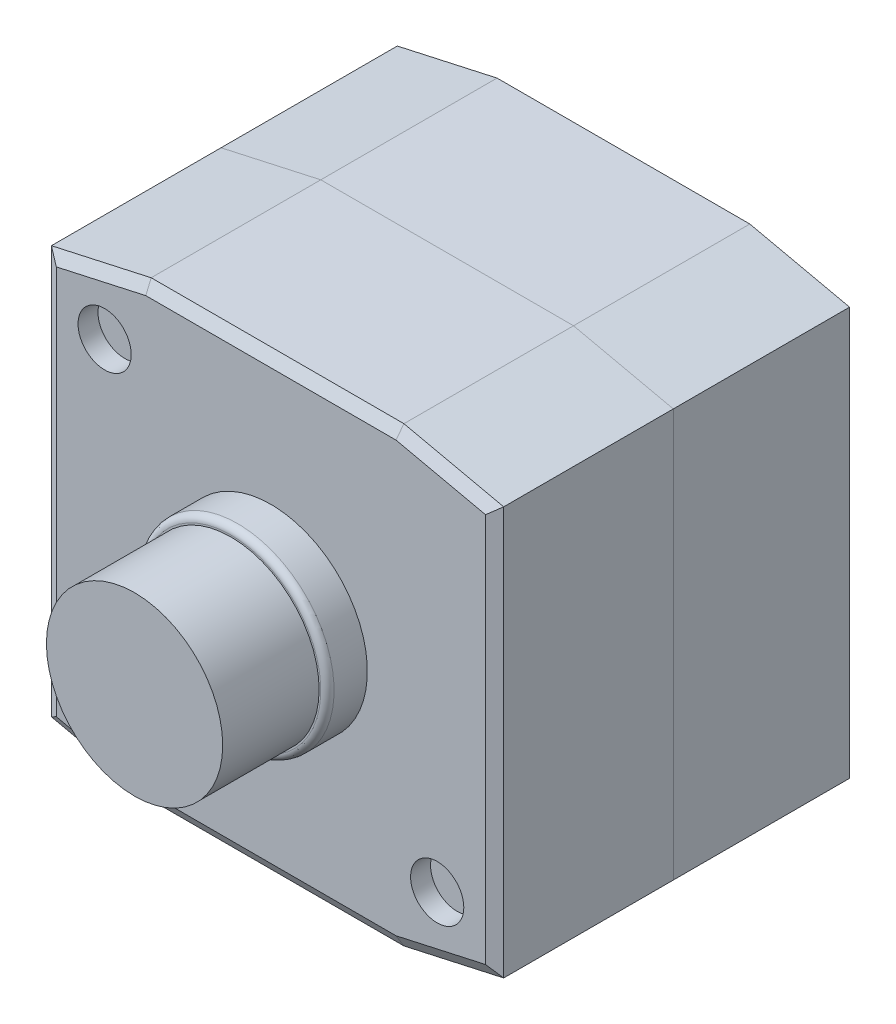
ISO-10303-21;
HEADER;
FILE_DESCRIPTION(('STEP AP214'),'2;1');
FILE_NAME('part.step','',(''),(''),'','','');
FILE_SCHEMA(('AUTOMOTIVE_DESIGN { 1 0 10303 214 1 1 1 1 }'));
ENDSEC;
DATA;
#1=APPLICATION_CONTEXT('core data for automotive mechanical design processes');
#2=APPLICATION_PROTOCOL_DEFINITION('international standard','automotive_design',2000,#1);
#3=PRODUCT_CONTEXT('',#1,'mechanical');
#4=PRODUCT('Part','Part','',(#3));
#5=PRODUCT_RELATED_PRODUCT_CATEGORY('part','',(#4));
#6=PRODUCT_DEFINITION_FORMATION('','',#4);
#7=PRODUCT_DEFINITION_CONTEXT('part definition',#1,'design');
#8=PRODUCT_DEFINITION('design','',#6,#7);
#9=PRODUCT_DEFINITION_SHAPE('','',#8);
#10=(LENGTH_UNIT() NAMED_UNIT(*) SI_UNIT(.MILLI.,.METRE.));
#11=(NAMED_UNIT(*) PLANE_ANGLE_UNIT() SI_UNIT($,.RADIAN.));
#12=(NAMED_UNIT(*) SI_UNIT($,.STERADIAN.) SOLID_ANGLE_UNIT());
#13=UNCERTAINTY_MEASURE_WITH_UNIT(LENGTH_MEASURE(1.E-05),#10,'distance_accuracy_value','');
#14=(GEOMETRIC_REPRESENTATION_CONTEXT(3) GLOBAL_UNCERTAINTY_ASSIGNED_CONTEXT((#13)) GLOBAL_UNIT_ASSIGNED_CONTEXT((#10,
#11,#12)) REPRESENTATION_CONTEXT('',''));
#15=CARTESIAN_POINT('',(0.,0.,0.));
#16=DIRECTION('',(0.,0.,1.));
#17=DIRECTION('',(1.,0.,0.));
#18=AXIS2_PLACEMENT_3D('',#15,#16,#17);
#19=CARTESIAN_POINT('',(-19.,0.,0.));
#20=DIRECTION('',(0.216439613938101,0.976296007119934,0.));
#21=DIRECTION('',(-0.976296007119934,0.216439613938101,0.));
#22=AXIS2_PLACEMENT_3D('',#19,#20,#21);
#23=PLANE('',#22);
#24=DIRECTION('',(-0.976296007119934,0.216439613938101,0.));
#25=VECTOR('',#24,1.);
#26=CARTESIAN_POINT('',(-19.,0.,26.5));
#27=LINE('',#26,#25);
#28=CARTESIAN_POINT('',(-19.,0.,26.5));
#29=VERTEX_POINT('',#28);
#30=CARTESIAN_POINT('',(-34.,3.32541993964407,26.5));
#31=VERTEX_POINT('',#30);
#32=EDGE_CURVE('E153',#29,#31,#27,.T.);
#33=ORIENTED_EDGE('',*,*,#32,.T.);
#34=DIRECTION('',(0.,0.,1.));
#35=VECTOR('',#34,1.);
#36=CARTESIAN_POINT('',(-34.,3.32541993964407,0.));
#37=LINE('',#36,#35);
#38=CARTESIAN_POINT('',(-34.,3.32541993964407,0.));
#39=VERTEX_POINT('',#38);
#40=EDGE_CURVE('E12',#39,#31,#37,.T.);
#41=ORIENTED_EDGE('',*,*,#40,.F.);
#42=DIRECTION('',(-0.976296007119934,0.216439613938101,0.));
#43=VECTOR('',#42,1.);
#44=CARTESIAN_POINT('',(-19.,0.,0.));
#45=LINE('',#44,#43);
#46=CARTESIAN_POINT('',(-19.,0.,0.));
#47=VERTEX_POINT('',#46);
#48=EDGE_CURVE('E167',#47,#39,#45,.T.);
#49=ORIENTED_EDGE('',*,*,#48,.F.);
#50=DIRECTION('',(0.,0.,1.));
#51=VECTOR('',#50,1.);
#52=CARTESIAN_POINT('',(-19.,0.,0.));
#53=LINE('',#52,#51);
#54=EDGE_CURVE('E149',#47,#29,#53,.T.);
#55=ORIENTED_EDGE('',*,*,#54,.T.);
#56=EDGE_LOOP('',(#33,#41,#49,#55));
#57=FACE_BOUND('',#56,.T.);
#58=ADVANCED_FACE('F57',(#57),#23,.F.);
#59=CARTESIAN_POINT('',(-34.,3.32541993964407,0.));
#60=DIRECTION('',(1.,0.,0.));
#61=DIRECTION('',(0.,1.,0.));
#62=AXIS2_PLACEMENT_3D('',#59,#60,#61);
#63=PLANE('',#62);
#64=DIRECTION('',(0.,1.,0.));
#65=VECTOR('',#64,1.);
#66=CARTESIAN_POINT('',(-34.,3.32541993964407,26.5));
#67=LINE('',#66,#65);
#68=CARTESIAN_POINT('',(-34.,64.674580060356,26.5));
#69=VERTEX_POINT('',#68);
#70=EDGE_CURVE('E156',#31,#69,#67,.T.);
#71=ORIENTED_EDGE('',*,*,#70,.T.);
#72=DIRECTION('',(0.,0.,1.));
#73=VECTOR('',#72,1.);
#74=CARTESIAN_POINT('',(-34.,64.674580060356,0.));
#75=LINE('',#74,#73);
#76=CARTESIAN_POINT('',(-34.,64.674580060356,0.));
#77=VERTEX_POINT('',#76);
#78=EDGE_CURVE('E65',#77,#69,#75,.T.);
#79=ORIENTED_EDGE('',*,*,#78,.F.);
#80=DIRECTION('',(0.,1.,0.));
#81=VECTOR('',#80,1.);
#82=CARTESIAN_POINT('',(-34.,3.32541993964407,0.));
#83=LINE('',#82,#81);
#84=EDGE_CURVE('E116',#39,#77,#83,.T.);
#85=ORIENTED_EDGE('',*,*,#84,.F.);
#86=ORIENTED_EDGE('',*,*,#40,.T.);
#87=EDGE_LOOP('',(#71,#79,#85,#86));
#88=FACE_BOUND('',#87,.T.);
#89=ADVANCED_FACE('F202',(#88),#63,.F.);
#90=CARTESIAN_POINT('',(-34.,64.674580060356,0.));
#91=DIRECTION('',(0.2164396139381,-0.976296007119934,0.));
#92=DIRECTION('',(0.976296007119934,0.2164396139381,0.));
#93=AXIS2_PLACEMENT_3D('',#90,#91,#92);
#94=PLANE('',#93);
#95=DIRECTION('',(0.976296007119934,0.2164396139381,0.));
#96=VECTOR('',#95,1.);
#97=CARTESIAN_POINT('',(-34.,64.674580060356,26.5));
#98=LINE('',#97,#96);
#99=CARTESIAN_POINT('',(-19.,68.,26.5));
#100=VERTEX_POINT('',#99);
#101=EDGE_CURVE('E158',#69,#100,#98,.T.);
#102=ORIENTED_EDGE('',*,*,#101,.T.);
#103=DIRECTION('',(0.,0.,1.));
#104=VECTOR('',#103,1.);
#105=CARTESIAN_POINT('',(-19.,68.,0.));
#106=LINE('',#105,#104);
#107=CARTESIAN_POINT('',(-19.,68.,0.));
#108=VERTEX_POINT('',#107);
#109=EDGE_CURVE('E174',#108,#100,#106,.T.);
#110=ORIENTED_EDGE('',*,*,#109,.F.);
#111=DIRECTION('',(0.976296007119934,0.2164396139381,0.));
#112=VECTOR('',#111,1.);
#113=CARTESIAN_POINT('',(-34.,64.674580060356,0.));
#114=LINE('',#113,#112);
#115=EDGE_CURVE('E182',#77,#108,#114,.T.);
#116=ORIENTED_EDGE('',*,*,#115,.F.);
#117=ORIENTED_EDGE('',*,*,#78,.T.);
#118=EDGE_LOOP('',(#102,#110,#116,#117));
#119=FACE_BOUND('',#118,.T.);
#120=ADVANCED_FACE('F180',(#119),#94,.F.);
#121=CARTESIAN_POINT('',(-19.,68.,0.));
#122=DIRECTION('',(0.,-1.,0.));
#123=DIRECTION('',(0.,0.,-1.));
#124=AXIS2_PLACEMENT_3D('',#121,#122,#123);
#125=PLANE('',#124);
#126=DIRECTION('',(1.,0.,0.));
#127=VECTOR('',#126,1.);
#128=CARTESIAN_POINT('',(-19.,68.,26.5));
#129=LINE('',#128,#127);
#130=CARTESIAN_POINT('',(19.,68.,26.5));
#131=VERTEX_POINT('',#130);
#132=EDGE_CURVE('E160',#100,#131,#129,.T.);
#133=ORIENTED_EDGE('',*,*,#132,.T.);
#134=DIRECTION('',(0.,0.,1.));
#135=VECTOR('',#134,1.);
#136=CARTESIAN_POINT('',(19.,68.,0.));
#137=LINE('',#136,#135);
#138=CARTESIAN_POINT('',(19.,68.,0.));
#139=VERTEX_POINT('',#138);
#140=EDGE_CURVE('E171',#139,#131,#137,.T.);
#141=ORIENTED_EDGE('',*,*,#140,.F.);
#142=DIRECTION('',(1.,0.,0.));
#143=VECTOR('',#142,1.);
#144=CARTESIAN_POINT('',(-19.,68.,0.));
#145=LINE('',#144,#143);
#146=EDGE_CURVE('E194',#108,#139,#145,.T.);
#147=ORIENTED_EDGE('',*,*,#146,.F.);
#148=ORIENTED_EDGE('',*,*,#109,.T.);
#149=EDGE_LOOP('',(#133,#141,#147,#148));
#150=FACE_BOUND('',#149,.T.);
#151=ADVANCED_FACE('F190',(#150),#125,.F.);
#152=CARTESIAN_POINT('',(19.,68.,0.));
#153=DIRECTION('',(-0.216439613938102,-0.976296007119934,0.));
#154=DIRECTION('',(0.976296007119934,-0.216439613938102,0.));
#155=AXIS2_PLACEMENT_3D('',#152,#153,#154);
#156=PLANE('',#155);
#157=DIRECTION('',(0.976296007119934,-0.216439613938102,0.));
#158=VECTOR('',#157,1.);
#159=CARTESIAN_POINT('',(19.,68.,26.5));
#160=LINE('',#159,#158);
#161=CARTESIAN_POINT('',(34.,64.6745800603559,26.5));
#162=VERTEX_POINT('',#161);
#163=EDGE_CURVE('E162',#131,#162,#160,.T.);
#164=ORIENTED_EDGE('',*,*,#163,.T.);
#165=DIRECTION('',(0.,0.,1.));
#166=VECTOR('',#165,1.);
#167=CARTESIAN_POINT('',(34.,64.6745800603559,0.));
#168=LINE('',#167,#166);
#169=CARTESIAN_POINT('',(34.,64.6745800603559,0.));
#170=VERTEX_POINT('',#169);
#171=EDGE_CURVE('E144',#170,#162,#168,.T.);
#172=ORIENTED_EDGE('',*,*,#171,.F.);
#173=DIRECTION('',(0.976296007119934,-0.216439613938102,0.));
#174=VECTOR('',#173,1.);
#175=CARTESIAN_POINT('',(19.,68.,0.));
#176=LINE('',#175,#174);
#177=EDGE_CURVE('E135',#139,#170,#176,.T.);
#178=ORIENTED_EDGE('',*,*,#177,.F.);
#179=ORIENTED_EDGE('',*,*,#140,.T.);
#180=EDGE_LOOP('',(#164,#172,#178,#179));
#181=FACE_BOUND('',#180,.T.);
#182=ADVANCED_FACE('F193',(#181),#156,.F.);
#183=CARTESIAN_POINT('',(34.,64.6745800603559,0.));
#184=DIRECTION('',(-1.,0.,0.));
#185=DIRECTION('',(0.,-1.,0.));
#186=AXIS2_PLACEMENT_3D('',#183,#184,#185);
#187=PLANE('',#186);
#188=DIRECTION('',(0.,-1.,0.));
#189=VECTOR('',#188,1.);
#190=CARTESIAN_POINT('',(34.,64.6745800603559,26.5));
#191=LINE('',#190,#189);
#192=CARTESIAN_POINT('',(34.,3.32541993964407,26.5));
#193=VERTEX_POINT('',#192);
#194=EDGE_CURVE('E143',#162,#193,#191,.T.);
#195=ORIENTED_EDGE('',*,*,#194,.T.);
#196=DIRECTION('',(0.,0.,1.));
#197=VECTOR('',#196,1.);
#198=CARTESIAN_POINT('',(34.,3.32541993964407,0.));
#199=LINE('',#198,#197);
#200=CARTESIAN_POINT('',(34.,3.32541993964407,0.));
#201=VERTEX_POINT('',#200);
#202=EDGE_CURVE('E140',#201,#193,#199,.T.);
#203=ORIENTED_EDGE('',*,*,#202,.F.);
#204=DIRECTION('',(0.,-1.,0.));
#205=VECTOR('',#204,1.);
#206=CARTESIAN_POINT('',(34.,64.6745800603559,0.));
#207=LINE('',#206,#205);
#208=EDGE_CURVE('E129',#170,#201,#207,.T.);
#209=ORIENTED_EDGE('',*,*,#208,.F.);
#210=ORIENTED_EDGE('',*,*,#171,.T.);
#211=EDGE_LOOP('',(#195,#203,#209,#210));
#212=FACE_BOUND('',#211,.T.);
#213=ADVANCED_FACE('F141',(#212),#187,.F.);
#214=CARTESIAN_POINT('',(34.,3.32541993964407,0.));
#215=DIRECTION('',(-0.216439613938101,0.976296007119934,0.));
#216=DIRECTION('',(-0.976296007119934,-0.216439613938101,0.));
#217=AXIS2_PLACEMENT_3D('',#214,#215,#216);
#218=PLANE('',#217);
#219=DIRECTION('',(-0.976296007119934,-0.216439613938101,0.));
#220=VECTOR('',#219,1.);
#221=CARTESIAN_POINT('',(34.,3.32541993964407,26.5));
#222=LINE('',#221,#220);
#223=CARTESIAN_POINT('',(19.,0.,26.5));
#224=VERTEX_POINT('',#223);
#225=EDGE_CURVE('E102',#193,#224,#222,.T.);
#226=ORIENTED_EDGE('',*,*,#225,.T.);
#227=DIRECTION('',(0.,0.,1.));
#228=VECTOR('',#227,1.);
#229=CARTESIAN_POINT('',(19.,0.,0.));
#230=LINE('',#229,#228);
#231=CARTESIAN_POINT('',(19.,0.,0.));
#232=VERTEX_POINT('',#231);
#233=EDGE_CURVE('E145',#232,#224,#230,.T.);
#234=ORIENTED_EDGE('',*,*,#233,.F.);
#235=DIRECTION('',(-0.976296007119934,-0.216439613938101,0.));
#236=VECTOR('',#235,1.);
#237=CARTESIAN_POINT('',(34.,3.32541993964407,0.));
#238=LINE('',#237,#236);
#239=EDGE_CURVE('E133',#201,#232,#238,.T.);
#240=ORIENTED_EDGE('',*,*,#239,.F.);
#241=ORIENTED_EDGE('',*,*,#202,.T.);
#242=EDGE_LOOP('',(#226,#234,#240,#241));
#243=FACE_BOUND('',#242,.T.);
#244=ADVANCED_FACE('F147',(#243),#218,.F.);
#245=CARTESIAN_POINT('',(19.,0.,0.));
#246=DIRECTION('',(0.,1.,0.));
#247=DIRECTION('',(0.,0.,1.));
#248=AXIS2_PLACEMENT_3D('',#245,#246,#247);
#249=PLANE('',#248);
#250=DIRECTION('',(-1.,0.,0.));
#251=VECTOR('',#250,1.);
#252=CARTESIAN_POINT('',(19.,0.,26.5));
#253=LINE('',#252,#251);
#254=EDGE_CURVE('E108',#224,#29,#253,.T.);
#255=ORIENTED_EDGE('',*,*,#254,.T.);
#256=ORIENTED_EDGE('',*,*,#54,.F.);
#257=DIRECTION('',(-1.,0.,0.));
#258=VECTOR('',#257,1.);
#259=CARTESIAN_POINT('',(19.,0.,0.));
#260=LINE('',#259,#258);
#261=EDGE_CURVE('E73',#232,#47,#260,.T.);
#262=ORIENTED_EDGE('',*,*,#261,.F.);
#263=ORIENTED_EDGE('',*,*,#233,.T.);
#264=EDGE_LOOP('',(#255,#256,#262,#263));
#265=FACE_BOUND('',#264,.T.);
#266=ADVANCED_FACE('F218',(#265),#249,.F.);
#267=CARTESIAN_POINT('',(0.,0.,0.));
#268=DIRECTION('',(0.,0.,-1.));
#269=DIRECTION('',(-1.,0.,0.));
#270=AXIS2_PLACEMENT_3D('',#267,#268,#269);
#271=PLANE('',#270);
#272=ORIENTED_EDGE('',*,*,#48,.T.);
#273=ORIENTED_EDGE('',*,*,#84,.T.);
#274=ORIENTED_EDGE('',*,*,#115,.T.);
#275=ORIENTED_EDGE('',*,*,#146,.T.);
#276=ORIENTED_EDGE('',*,*,#177,.T.);
#277=ORIENTED_EDGE('',*,*,#208,.T.);
#278=ORIENTED_EDGE('',*,*,#239,.T.);
#279=ORIENTED_EDGE('',*,*,#261,.T.);
#280=EDGE_LOOP('',(#272,#273,#274,#275,#276,#277,#278,#279));
#281=FACE_BOUND('',#280,.T.);
#282=ADVANCED_FACE('F131',(#281),#271,.T.);
#283=CARTESIAN_POINT('',(0.,0.,26.5));
#284=DIRECTION('',(0.,0.,-1.));
#285=DIRECTION('',(-1.,0.,0.));
#286=AXIS2_PLACEMENT_3D('',#283,#284,#285);
#287=PLANE('',#286);
#288=ORIENTED_EDGE('',*,*,#32,.F.);
#289=ORIENTED_EDGE('',*,*,#254,.F.);
#290=ORIENTED_EDGE('',*,*,#225,.F.);
#291=ORIENTED_EDGE('',*,*,#194,.F.);
#292=ORIENTED_EDGE('',*,*,#163,.F.);
#293=ORIENTED_EDGE('',*,*,#132,.F.);
#294=ORIENTED_EDGE('',*,*,#101,.F.);
#295=ORIENTED_EDGE('',*,*,#70,.F.);
#296=EDGE_LOOP('',(#288,#289,#290,#291,#292,#293,#294,#295));
#297=FACE_BOUND('',#296,.T.);
#298=ADVANCED_FACE('F186',(#297),#287,.F.);
#299=CLOSED_SHELL('',(#58,#89,#120,#151,#182,#213,#244,#266,#282,#298));
#300=MANIFOLD_SOLID_BREP('B2',#299);
#301=CARTESIAN_POINT('',(0.,34.,53.));
#302=DIRECTION('',(0.,0.,1.));
#303=DIRECTION('',(1.,0.,0.));
#304=AXIS2_PLACEMENT_3D('',#301,#302,#303);
#305=CYLINDRICAL_SURFACE('',#304,14.5);
#306=CARTESIAN_POINT('',(0.,34.,58.));
#307=DIRECTION('',(0.,0.,-1.));
#308=DIRECTION('',(-1.,0.,0.));
#309=AXIS2_PLACEMENT_3D('',#306,#307,#308);
#310=CIRCLE('',#309,14.5);
#311=CARTESIAN_POINT('',(-14.5,34.,58.));
#312=VERTEX_POINT('',#311);
#313=EDGE_CURVE('E313',#312,#312,#310,.T.);
#314=ORIENTED_EDGE('',*,*,#313,.T.);
#315=EDGE_LOOP('',(#314));
#316=FACE_BOUND('',#315,.T.);
#317=CARTESIAN_POINT('',(0.,34.,53.));
#318=DIRECTION('',(0.,0.,1.));
#319=DIRECTION('',(-1.,0.,0.));
#320=AXIS2_PLACEMENT_3D('',#317,#318,#319);
#321=CIRCLE('',#320,14.5);
#322=CARTESIAN_POINT('',(-14.5,34.,53.));
#323=VERTEX_POINT('',#322);
#324=EDGE_CURVE('E446',#323,#323,#321,.T.);
#325=ORIENTED_EDGE('',*,*,#324,.T.);
#326=EDGE_LOOP('',(#325));
#327=FACE_BOUND('',#326,.T.);
#328=ADVANCED_FACE('F305',(#316,#327),#305,.T.);
#329=CARTESIAN_POINT('',(0.,34.,59.));
#330=DIRECTION('',(0.,0.,-1.));
#331=DIRECTION('',(-1.,0.,0.));
#332=AXIS2_PLACEMENT_3D('',#329,#330,#331);
#333=PLANE('',#332);
#334=CARTESIAN_POINT('',(0.,34.,59.));
#335=DIRECTION('',(0.,0.,-1.));
#336=DIRECTION('',(-1.,0.,0.));
#337=AXIS2_PLACEMENT_3D('',#334,#335,#336);
#338=CIRCLE('',#337,13.25);
#339=CARTESIAN_POINT('',(-13.25,34.,59.));
#340=VERTEX_POINT('',#339);
#341=EDGE_CURVE('E55',#340,#340,#338,.F.);
#342=ORIENTED_EDGE('',*,*,#341,.F.);
#343=EDGE_LOOP('',(#342));
#344=FACE_BOUND('',#343,.T.);
#345=CARTESIAN_POINT('',(0.,34.,59.));
#346=DIRECTION('',(0.,0.,-1.));
#347=DIRECTION('',(-1.,0.,0.));
#348=AXIS2_PLACEMENT_3D('',#345,#346,#347);
#349=CIRCLE('',#348,13.5);
#350=CARTESIAN_POINT('',(-13.5,34.,59.));
#351=VERTEX_POINT('',#350);
#352=EDGE_CURVE('E519',#351,#351,#349,.F.);
#353=ORIENTED_EDGE('',*,*,#352,.T.);
#354=EDGE_LOOP('',(#353));
#355=FACE_BOUND('',#354,.T.);
#356=ADVANCED_FACE('F532',(#344,#355),#333,.F.);
#357=CARTESIAN_POINT('',(-34.,3.32541993964407,26.5));
#358=DIRECTION('',(-0.216439613938101,-0.976296007119934,0.));
#359=DIRECTION('',(0.976296007119934,-0.216439613938101,0.));
#360=AXIS2_PLACEMENT_3D('',#357,#358,#359);
#361=PLANE('',#360);
#362=DIRECTION('',(0.,0.,1.));
#363=VECTOR('',#362,1.);
#364=CARTESIAN_POINT('',(-19.,0.,26.5));
#365=LINE('',#364,#363);
#366=CARTESIAN_POINT('',(-19.,0.,26.5));
#367=VERTEX_POINT('',#366);
#368=CARTESIAN_POINT('',(-19.,0.,52.));
#369=VERTEX_POINT('',#368);
#370=EDGE_CURVE('E397',#367,#369,#365,.T.);
#371=ORIENTED_EDGE('',*,*,#370,.T.);
#372=DIRECTION('',(-0.976296007119934,0.216439613938101,0.));
#373=VECTOR('',#372,1.);
#374=CARTESIAN_POINT('',(-34.,3.32541993964407,52.));
#375=LINE('',#374,#373);
#376=CARTESIAN_POINT('',(-34.,3.32541993964407,52.));
#377=VERTEX_POINT('',#376);
#378=EDGE_CURVE('E488',#369,#377,#375,.T.);
#379=ORIENTED_EDGE('',*,*,#378,.T.);
#380=DIRECTION('',(0.,0.,1.));
#381=VECTOR('',#380,1.);
#382=CARTESIAN_POINT('',(-34.,3.32541993964407,26.5));
#383=LINE('',#382,#381);
#384=CARTESIAN_POINT('',(-34.,3.32541993964407,26.5));
#385=VERTEX_POINT('',#384);
#386=EDGE_CURVE('E423',#385,#377,#383,.T.);
#387=ORIENTED_EDGE('',*,*,#386,.F.);
#388=DIRECTION('',(0.976296007119934,-0.216439613938101,0.));
#389=VECTOR('',#388,1.);
#390=CARTESIAN_POINT('',(-34.,3.32541993964407,26.5));
#391=LINE('',#390,#389);
#392=EDGE_CURVE('E415',#385,#367,#391,.T.);
#393=ORIENTED_EDGE('',*,*,#392,.T.);
#394=EDGE_LOOP('',(#371,#379,#387,#393));
#395=FACE_BOUND('',#394,.T.);
#396=ADVANCED_FACE('F421',(#395),#361,.T.);
#397=CARTESIAN_POINT('',(-34.,64.674580060356,26.5));
#398=DIRECTION('',(-1.,0.,0.));
#399=DIRECTION('',(0.,-1.,0.));
#400=AXIS2_PLACEMENT_3D('',#397,#398,#399);
#401=PLANE('',#400);
#402=ORIENTED_EDGE('',*,*,#386,.T.);
#403=DIRECTION('',(0.,1.,0.));
#404=VECTOR('',#403,1.);
#405=CARTESIAN_POINT('',(-34.,64.674580060356,52.));
#406=LINE('',#405,#404);
#407=CARTESIAN_POINT('',(-34.,64.674580060356,52.));
#408=VERTEX_POINT('',#407);
#409=EDGE_CURVE('E486',#377,#408,#406,.T.);
#410=ORIENTED_EDGE('',*,*,#409,.T.);
#411=DIRECTION('',(0.,0.,1.));
#412=VECTOR('',#411,1.);
#413=CARTESIAN_POINT('',(-34.,64.674580060356,26.5));
#414=LINE('',#413,#412);
#415=CARTESIAN_POINT('',(-34.,64.674580060356,26.5));
#416=VERTEX_POINT('',#415);
#417=EDGE_CURVE('E447',#416,#408,#414,.T.);
#418=ORIENTED_EDGE('',*,*,#417,.F.);
#419=DIRECTION('',(0.,-1.,0.));
#420=VECTOR('',#419,1.);
#421=CARTESIAN_POINT('',(-34.,64.674580060356,26.5));
#422=LINE('',#421,#420);
#423=EDGE_CURVE('E408',#416,#385,#422,.T.);
#424=ORIENTED_EDGE('',*,*,#423,.T.);
#425=EDGE_LOOP('',(#402,#410,#418,#424));
#426=FACE_BOUND('',#425,.T.);
#427=ADVANCED_FACE('F540',(#426),#401,.T.);
#428=CARTESIAN_POINT('',(-19.,68.,26.5));
#429=DIRECTION('',(-0.2164396139381,0.976296007119934,0.));
#430=DIRECTION('',(-0.976296007119934,-0.2164396139381,0.));
#431=AXIS2_PLACEMENT_3D('',#428,#429,#430);
#432=PLANE('',#431);
#433=ORIENTED_EDGE('',*,*,#417,.T.);
#434=DIRECTION('',(0.976296007119934,0.2164396139381,0.));
#435=VECTOR('',#434,1.);
#436=CARTESIAN_POINT('',(-19.,68.,52.));
#437=LINE('',#436,#435);
#438=CARTESIAN_POINT('',(-19.,68.,52.));
#439=VERTEX_POINT('',#438);
#440=EDGE_CURVE('E484',#408,#439,#437,.T.);
#441=ORIENTED_EDGE('',*,*,#440,.T.);
#442=DIRECTION('',(0.,0.,1.));
#443=VECTOR('',#442,1.);
#444=CARTESIAN_POINT('',(-19.,68.,26.5));
#445=LINE('',#444,#443);
#446=CARTESIAN_POINT('',(-19.,68.,26.5));
#447=VERTEX_POINT('',#446);
#448=EDGE_CURVE('E450',#447,#439,#445,.T.);
#449=ORIENTED_EDGE('',*,*,#448,.F.);
#450=DIRECTION('',(-0.976296007119934,-0.2164396139381,0.));
#451=VECTOR('',#450,1.);
#452=CARTESIAN_POINT('',(-19.,68.,26.5));
#453=LINE('',#452,#451);
#454=EDGE_CURVE('E441',#447,#416,#453,.T.);
#455=ORIENTED_EDGE('',*,*,#454,.T.);
#456=EDGE_LOOP('',(#433,#441,#449,#455));
#457=FACE_BOUND('',#456,.T.);
#458=ADVANCED_FACE('F630',(#457),#432,.T.);
#459=CARTESIAN_POINT('',(19.,68.,26.5));
#460=DIRECTION('',(0.,1.,0.));
#461=DIRECTION('',(0.,0.,1.));
#462=AXIS2_PLACEMENT_3D('',#459,#460,#461);
#463=PLANE('',#462);
#464=ORIENTED_EDGE('',*,*,#448,.T.);
#465=DIRECTION('',(1.,0.,0.));
#466=VECTOR('',#465,1.);
#467=CARTESIAN_POINT('',(19.,68.,52.));
#468=LINE('',#467,#466);
#469=CARTESIAN_POINT('',(19.,68.,52.));
#470=VERTEX_POINT('',#469);
#471=EDGE_CURVE('E482',#439,#470,#468,.T.);
#472=ORIENTED_EDGE('',*,*,#471,.T.);
#473=DIRECTION('',(0.,0.,1.));
#474=VECTOR('',#473,1.);
#475=CARTESIAN_POINT('',(19.,68.,26.5));
#476=LINE('',#475,#474);
#477=CARTESIAN_POINT('',(19.,68.,26.5));
#478=VERTEX_POINT('',#477);
#479=EDGE_CURVE('E453',#478,#470,#476,.T.);
#480=ORIENTED_EDGE('',*,*,#479,.F.);
#481=DIRECTION('',(-1.,0.,0.));
#482=VECTOR('',#481,1.);
#483=CARTESIAN_POINT('',(19.,68.,26.5));
#484=LINE('',#483,#482);
#485=EDGE_CURVE('E438',#478,#447,#484,.T.);
#486=ORIENTED_EDGE('',*,*,#485,.T.);
#487=EDGE_LOOP('',(#464,#472,#480,#486));
#488=FACE_BOUND('',#487,.T.);
#489=ADVANCED_FACE('F628',(#488),#463,.T.);
#490=CARTESIAN_POINT('',(34.,64.6745800603559,26.5));
#491=DIRECTION('',(0.216439613938102,0.976296007119934,0.));
#492=DIRECTION('',(-0.976296007119934,0.216439613938102,0.));
#493=AXIS2_PLACEMENT_3D('',#490,#491,#492);
#494=PLANE('',#493);
#495=ORIENTED_EDGE('',*,*,#479,.T.);
#496=DIRECTION('',(0.976296007119934,-0.216439613938102,0.));
#497=VECTOR('',#496,1.);
#498=CARTESIAN_POINT('',(34.,64.6745800603559,52.));
#499=LINE('',#498,#497);
#500=CARTESIAN_POINT('',(34.,64.6745800603559,52.));
#501=VERTEX_POINT('',#500);
#502=EDGE_CURVE('E479',#470,#501,#499,.T.);
#503=ORIENTED_EDGE('',*,*,#502,.T.);
#504=DIRECTION('',(0.,0.,1.));
#505=VECTOR('',#504,1.);
#506=CARTESIAN_POINT('',(34.,64.6745800603559,26.5));
#507=LINE('',#506,#505);
#508=CARTESIAN_POINT('',(34.,64.6745800603559,26.5));
#509=VERTEX_POINT('',#508);
#510=EDGE_CURVE('E456',#509,#501,#507,.T.);
#511=ORIENTED_EDGE('',*,*,#510,.F.);
#512=DIRECTION('',(-0.976296007119934,0.216439613938102,0.));
#513=VECTOR('',#512,1.);
#514=CARTESIAN_POINT('',(34.,64.6745800603559,26.5));
#515=LINE('',#514,#513);
#516=EDGE_CURVE('E435',#509,#478,#515,.T.);
#517=ORIENTED_EDGE('',*,*,#516,.T.);
#518=EDGE_LOOP('',(#495,#503,#511,#517));
#519=FACE_BOUND('',#518,.T.);
#520=ADVANCED_FACE('F626',(#519),#494,.T.);
#521=CARTESIAN_POINT('',(34.,3.32541993964407,26.5));
#522=DIRECTION('',(1.,0.,0.));
#523=DIRECTION('',(0.,1.,0.));
#524=AXIS2_PLACEMENT_3D('',#521,#522,#523);
#525=PLANE('',#524);
#526=ORIENTED_EDGE('',*,*,#510,.T.);
#527=DIRECTION('',(0.,-1.,0.));
#528=VECTOR('',#527,1.);
#529=CARTESIAN_POINT('',(34.,3.32541993964407,52.));
#530=LINE('',#529,#528);
#531=CARTESIAN_POINT('',(34.,3.32541993964407,52.));
#532=VERTEX_POINT('',#531);
#533=EDGE_CURVE('E516',#501,#532,#530,.T.);
#534=ORIENTED_EDGE('',*,*,#533,.T.);
#535=DIRECTION('',(0.,0.,1.));
#536=VECTOR('',#535,1.);
#537=CARTESIAN_POINT('',(34.,3.32541993964407,26.5));
#538=LINE('',#537,#536);
#539=CARTESIAN_POINT('',(34.,3.32541993964407,26.5));
#540=VERTEX_POINT('',#539);
#541=EDGE_CURVE('E459',#540,#532,#538,.T.);
#542=ORIENTED_EDGE('',*,*,#541,.F.);
#543=DIRECTION('',(0.,1.,0.));
#544=VECTOR('',#543,1.);
#545=CARTESIAN_POINT('',(34.,3.32541993964407,26.5));
#546=LINE('',#545,#544);
#547=EDGE_CURVE('E432',#540,#509,#546,.T.);
#548=ORIENTED_EDGE('',*,*,#547,.T.);
#549=EDGE_LOOP('',(#526,#534,#542,#548));
#550=FACE_BOUND('',#549,.T.);
#551=ADVANCED_FACE('F621',(#550),#525,.T.);
#552=CARTESIAN_POINT('',(19.,0.,26.5));
#553=DIRECTION('',(0.216439613938101,-0.976296007119934,0.));
#554=DIRECTION('',(0.976296007119934,0.216439613938101,0.));
#555=AXIS2_PLACEMENT_3D('',#552,#553,#554);
#556=PLANE('',#555);
#557=ORIENTED_EDGE('',*,*,#541,.T.);
#558=DIRECTION('',(-0.976296007119934,-0.216439613938101,0.));
#559=VECTOR('',#558,1.);
#560=CARTESIAN_POINT('',(19.,0.,52.));
#561=LINE('',#560,#559);
#562=CARTESIAN_POINT('',(19.,0.,52.));
#563=VERTEX_POINT('',#562);
#564=EDGE_CURVE('E491',#532,#563,#561,.T.);
#565=ORIENTED_EDGE('',*,*,#564,.T.);
#566=DIRECTION('',(0.,0.,1.));
#567=VECTOR('',#566,1.);
#568=CARTESIAN_POINT('',(19.,0.,26.5));
#569=LINE('',#568,#567);
#570=CARTESIAN_POINT('',(19.,0.,26.5));
#571=VERTEX_POINT('',#570);
#572=EDGE_CURVE('E407',#571,#563,#569,.T.);
#573=ORIENTED_EDGE('',*,*,#572,.F.);
#574=DIRECTION('',(0.976296007119934,0.216439613938101,0.));
#575=VECTOR('',#574,1.);
#576=CARTESIAN_POINT('',(19.,0.,26.5));
#577=LINE('',#576,#575);
#578=EDGE_CURVE('E419',#571,#540,#577,.T.);
#579=ORIENTED_EDGE('',*,*,#578,.T.);
#580=EDGE_LOOP('',(#557,#565,#573,#579));
#581=FACE_BOUND('',#580,.T.);
#582=ADVANCED_FACE('F619',(#581),#556,.T.);
#583=CARTESIAN_POINT('',(-19.,0.,26.5));
#584=DIRECTION('',(0.,-1.,0.));
#585=DIRECTION('',(0.,0.,-1.));
#586=AXIS2_PLACEMENT_3D('',#583,#584,#585);
#587=PLANE('',#586);
#588=ORIENTED_EDGE('',*,*,#572,.T.);
#589=DIRECTION('',(-1.,0.,0.));
#590=VECTOR('',#589,1.);
#591=CARTESIAN_POINT('',(-19.,0.,52.));
#592=LINE('',#591,#590);
#593=EDGE_CURVE('E403',#563,#369,#592,.T.);
#594=ORIENTED_EDGE('',*,*,#593,.T.);
#595=ORIENTED_EDGE('',*,*,#370,.F.);
#596=DIRECTION('',(1.,0.,0.));
#597=VECTOR('',#596,1.);
#598=CARTESIAN_POINT('',(-19.,0.,26.5));
#599=LINE('',#598,#597);
#600=EDGE_CURVE('E401',#367,#571,#599,.T.);
#601=ORIENTED_EDGE('',*,*,#600,.T.);
#602=EDGE_LOOP('',(#588,#594,#595,#601));
#603=FACE_BOUND('',#602,.T.);
#604=ADVANCED_FACE('F400',(#603),#587,.T.);
#605=CARTESIAN_POINT('',(0.,0.,26.5));
#606=DIRECTION('',(0.,0.,1.));
#607=DIRECTION('',(1.,0.,0.));
#608=AXIS2_PLACEMENT_3D('',#605,#606,#607);
#609=PLANE('',#608);
#610=ORIENTED_EDGE('',*,*,#392,.F.);
#611=ORIENTED_EDGE('',*,*,#423,.F.);
#612=ORIENTED_EDGE('',*,*,#454,.F.);
#613=ORIENTED_EDGE('',*,*,#485,.F.);
#614=ORIENTED_EDGE('',*,*,#516,.F.);
#615=ORIENTED_EDGE('',*,*,#547,.F.);
#616=ORIENTED_EDGE('',*,*,#578,.F.);
#617=ORIENTED_EDGE('',*,*,#600,.F.);
#618=EDGE_LOOP('',(#610,#611,#612,#613,#614,#615,#616,#617));
#619=FACE_BOUND('',#618,.T.);
#620=ADVANCED_FACE('F413',(#619),#609,.F.);
#621=CARTESIAN_POINT('',(0.,0.,53.));
#622=DIRECTION('',(0.,0.,1.));
#623=DIRECTION('',(1.,0.,0.));
#624=AXIS2_PLACEMENT_3D('',#621,#622,#623);
#625=PLANE('',#624);
#626=CARTESIAN_POINT('',(-25.,57.5,53.));
#627=DIRECTION('',(0.,0.,1.));
#628=DIRECTION('',(1.,0.,0.));
#629=AXIS2_PLACEMENT_3D('',#626,#627,#628);
#630=CIRCLE('',#629,3.99999999999999);
#631=CARTESIAN_POINT('',(-21.,57.5,53.));
#632=VERTEX_POINT('',#631);
#633=EDGE_CURVE('E513',#632,#632,#630,.T.);
#634=ORIENTED_EDGE('',*,*,#633,.F.);
#635=EDGE_LOOP('',(#634));
#636=FACE_BOUND('',#635,.T.);
#637=CARTESIAN_POINT('',(25.,10.5,53.));
#638=DIRECTION('',(0.,0.,1.));
#639=DIRECTION('',(1.,0.,0.));
#640=AXIS2_PLACEMENT_3D('',#637,#638,#639);
#641=CIRCLE('',#640,3.99999999999999);
#642=CARTESIAN_POINT('',(29.,10.5,53.));
#643=VERTEX_POINT('',#642);
#644=EDGE_CURVE('E427',#643,#643,#641,.T.);
#645=ORIENTED_EDGE('',*,*,#644,.F.);
#646=EDGE_LOOP('',(#645));
#647=FACE_BOUND('',#646,.T.);
#648=ORIENTED_EDGE('',*,*,#324,.F.);
#649=EDGE_LOOP('',(#648));
#650=FACE_BOUND('',#649,.T.);
#651=DIRECTION('',(0.976296007119934,0.216439613938101,0.));
#652=VECTOR('',#651,1.);
#653=CARTESIAN_POINT('',(0.515191615040425,-2.32387919897825,53.));
#654=LINE('',#653,#652);
#655=CARTESIAN_POINT('',(18.8103095858309,1.73205080756889,53.));
#656=VERTEX_POINT('',#655);
#657=CARTESIAN_POINT('',(32.2679491924311,4.71553768012438,53.));
#658=VERTEX_POINT('',#657);
#659=EDGE_CURVE('E465',#656,#658,#654,.T.);
#660=ORIENTED_EDGE('',*,*,#659,.T.);
#661=DIRECTION('',(0.,1.,0.));
#662=VECTOR('',#661,1.);
#663=CARTESIAN_POINT('',(32.2679491924311,0.,53.));
#664=LINE('',#663,#662);
#665=CARTESIAN_POINT('',(32.2679491924311,63.2844623198756,53.));
#666=VERTEX_POINT('',#665);
#667=EDGE_CURVE('E493',#658,#666,#664,.T.);
#668=ORIENTED_EDGE('',*,*,#667,.T.);
#669=DIRECTION('',(-0.976296007119934,0.216439613938102,0.));
#670=VECTOR('',#669,1.);
#671=CARTESIAN_POINT('',(14.8842125142241,67.1383439582244,53.));
#672=LINE('',#671,#670);
#673=CARTESIAN_POINT('',(18.8103095858308,66.2679491924311,53.));
#674=VERTEX_POINT('',#673);
#675=EDGE_CURVE('E477',#666,#674,#672,.T.);
#676=ORIENTED_EDGE('',*,*,#675,.T.);
#677=DIRECTION('',(-1.,0.,0.));
#678=VECTOR('',#677,1.);
#679=CARTESIAN_POINT('',(0.,66.2679491924311,53.));
#680=LINE('',#679,#678);
#681=CARTESIAN_POINT('',(-18.8103095858308,66.2679491924311,53.));
#682=VERTEX_POINT('',#681);
#683=EDGE_CURVE('E475',#674,#682,#680,.T.);
#684=ORIENTED_EDGE('',*,*,#683,.T.);
#685=DIRECTION('',(-0.976296007119934,-0.2164396139381,0.));
#686=VECTOR('',#685,1.);
#687=CARTESIAN_POINT('',(-14.884212514224,67.1383439582244,53.));
#688=LINE('',#687,#686);
#689=CARTESIAN_POINT('',(-32.2679491924311,63.2844623198756,53.));
#690=VERTEX_POINT('',#689);
#691=EDGE_CURVE('E473',#682,#690,#688,.T.);
#692=ORIENTED_EDGE('',*,*,#691,.T.);
#693=DIRECTION('',(0.,-1.,0.));
#694=VECTOR('',#693,1.);
#695=CARTESIAN_POINT('',(-32.2679491924311,0.,53.));
#696=LINE('',#695,#694);
#697=CARTESIAN_POINT('',(-32.2679491924311,4.71553768012437,53.));
#698=VERTEX_POINT('',#697);
#699=EDGE_CURVE('E471',#690,#698,#696,.T.);
#700=ORIENTED_EDGE('',*,*,#699,.T.);
#701=DIRECTION('',(0.976296007119934,-0.216439613938101,0.));
#702=VECTOR('',#701,1.);
#703=CARTESIAN_POINT('',(-0.515191615040424,-2.32387919897825,53.));
#704=LINE('',#703,#702);
#705=CARTESIAN_POINT('',(-18.8103095858309,1.73205080756889,53.));
#706=VERTEX_POINT('',#705);
#707=EDGE_CURVE('E469',#698,#706,#704,.T.);
#708=ORIENTED_EDGE('',*,*,#707,.T.);
#709=DIRECTION('',(1.,0.,0.));
#710=VECTOR('',#709,1.);
#711=CARTESIAN_POINT('',(0.,1.73205080756889,53.));
#712=LINE('',#711,#710);
#713=EDGE_CURVE('E467',#706,#656,#712,.T.);
#714=ORIENTED_EDGE('',*,*,#713,.T.);
#715=EDGE_LOOP('',(#660,#668,#676,#684,#692,#700,#708,#714));
#716=FACE_BOUND('',#715,.T.);
#717=ADVANCED_FACE('F602',(#636,#647,#650,#716),#625,.T.);
#718=CARTESIAN_POINT('',(25.,10.5,50.));
#719=DIRECTION('',(0.,0.,-1.));
#720=DIRECTION('',(-1.,0.,0.));
#721=AXIS2_PLACEMENT_3D('',#718,#719,#720);
#722=PLANE('',#721);
#723=CARTESIAN_POINT('',(25.,10.5,50.));
#724=DIRECTION('',(0.,0.,1.));
#725=DIRECTION('',(1.,0.,0.));
#726=AXIS2_PLACEMENT_3D('',#723,#724,#725);
#727=CIRCLE('',#726,3.99999999999999);
#728=CARTESIAN_POINT('',(29.,10.5,50.));
#729=VERTEX_POINT('',#728);
#730=EDGE_CURVE('E424',#729,#729,#727,.T.);
#731=ORIENTED_EDGE('',*,*,#730,.T.);
#732=EDGE_LOOP('',(#731));
#733=FACE_BOUND('',#732,.T.);
#734=ADVANCED_FACE('F655',(#733),#722,.F.);
#735=CARTESIAN_POINT('',(25.,10.5,53.));
#736=DIRECTION('',(0.,0.,1.));
#737=DIRECTION('',(1.,0.,0.));
#738=AXIS2_PLACEMENT_3D('',#735,#736,#737);
#739=CYLINDRICAL_SURFACE('',#738,3.99999999999999);
#740=ORIENTED_EDGE('',*,*,#730,.F.);
#741=EDGE_LOOP('',(#740));
#742=FACE_BOUND('',#741,.T.);
#743=ORIENTED_EDGE('',*,*,#644,.T.);
#744=EDGE_LOOP('',(#743));
#745=FACE_BOUND('',#744,.T.);
#746=ADVANCED_FACE('F660',(#742,#745),#739,.F.);
#747=CARTESIAN_POINT('',(-25.,57.5,50.));
#748=DIRECTION('',(0.,0.,-1.));
#749=DIRECTION('',(-1.,0.,0.));
#750=AXIS2_PLACEMENT_3D('',#747,#748,#749);
#751=PLANE('',#750);
#752=CARTESIAN_POINT('',(-25.,57.5,50.));
#753=DIRECTION('',(0.,0.,1.));
#754=DIRECTION('',(1.,0.,0.));
#755=AXIS2_PLACEMENT_3D('',#752,#753,#754);
#756=CIRCLE('',#755,3.99999999999999);
#757=CARTESIAN_POINT('',(-21.,57.5,50.));
#758=VERTEX_POINT('',#757);
#759=EDGE_CURVE('E686',#758,#758,#756,.T.);
#760=ORIENTED_EDGE('',*,*,#759,.T.);
#761=EDGE_LOOP('',(#760));
#762=FACE_BOUND('',#761,.T.);
#763=ADVANCED_FACE('F664',(#762),#751,.F.);
#764=CARTESIAN_POINT('',(-25.,57.5,53.));
#765=DIRECTION('',(0.,0.,1.));
#766=DIRECTION('',(1.,0.,0.));
#767=AXIS2_PLACEMENT_3D('',#764,#765,#766);
#768=CYLINDRICAL_SURFACE('',#767,3.99999999999999);
#769=ORIENTED_EDGE('',*,*,#759,.F.);
#770=EDGE_LOOP('',(#769));
#771=FACE_BOUND('',#770,.T.);
#772=ORIENTED_EDGE('',*,*,#633,.T.);
#773=EDGE_LOOP('',(#772));
#774=FACE_BOUND('',#773,.T.);
#775=ADVANCED_FACE('F594',(#771,#774),#768,.F.);
#776=CARTESIAN_POINT('',(0.515191615040425,-2.32387919897825,53.));
#777=DIRECTION('',(-0.10821980696905,0.488148003559964,-0.86602540378444));
#778=DIRECTION('',(0.976296007119934,0.216439613938101,0.));
#779=AXIS2_PLACEMENT_3D('',#776,#777,#778);
#780=PLANE('',#779);
#781=ORIENTED_EDGE('',*,*,#564,.F.);
#782=DIRECTION('',(-0.711122489842335,0.570736138030448,0.410566760937277));
#783=VECTOR('',#782,1.);
#784=CARTESIAN_POINT('',(19.0677732291786,15.3097989476303,60.6211251457344));
#785=LINE('',#784,#783);
#786=EDGE_CURVE('E320',#532,#658,#785,.T.);
#787=ORIENTED_EDGE('',*,*,#786,.T.);
#788=ORIENTED_EDGE('',*,*,#659,.F.);
#789=DIRECTION('',(0.0944214683896748,-0.862156273381083,-0.497766156520089));
#790=VECTOR('',#789,1.);
#791=CARTESIAN_POINT('',(18.9773783273599,0.206557018374013,52.1192557501612));
#792=LINE('',#791,#790);
#793=EDGE_CURVE('E510',#563,#656,#792,.F.);
#794=ORIENTED_EDGE('',*,*,#793,.F.);
#795=EDGE_LOOP('',(#781,#787,#788,#794));
#796=FACE_BOUND('',#795,.T.);
#797=ADVANCED_FACE('F589',(#796),#780,.F.);
#798=CARTESIAN_POINT('',(0.,1.73205080756889,53.));
#799=DIRECTION('',(0.,0.499999999999997,-0.86602540378444));
#800=DIRECTION('',(1.,0.,0.));
#801=AXIS2_PLACEMENT_3D('',#798,#799,#800);
#802=PLANE('',#801);
#803=ORIENTED_EDGE('',*,*,#793,.T.);
#804=ORIENTED_EDGE('',*,*,#713,.F.);
#805=DIRECTION('',(-0.0944214683896692,-0.862156273381083,-0.497766156520089));
#806=VECTOR('',#805,1.);
#807=CARTESIAN_POINT('',(-18.6426078941824,3.26332402304849,53.88408100316));
#808=LINE('',#807,#806);
#809=EDGE_CURVE('E507',#369,#706,#808,.F.);
#810=ORIENTED_EDGE('',*,*,#809,.F.);
#811=ORIENTED_EDGE('',*,*,#593,.F.);
#812=EDGE_LOOP('',(#803,#804,#810,#811));
#813=FACE_BOUND('',#812,.T.);
#814=ADVANCED_FACE('F582',(#813),#802,.F.);
#815=CARTESIAN_POINT('',(-0.515191615040424,-2.32387919897825,53.));
#816=DIRECTION('',(0.10821980696905,0.488148003559965,-0.86602540378444));
#817=DIRECTION('',(0.976296007119934,-0.216439613938101,0.));
#818=AXIS2_PLACEMENT_3D('',#815,#816,#817);
#819=PLANE('',#818);
#820=ORIENTED_EDGE('',*,*,#809,.T.);
#821=ORIENTED_EDGE('',*,*,#707,.F.);
#822=DIRECTION('',(-0.711122489842347,-0.570736138030437,-0.410566760937272));
#823=VECTOR('',#822,1.);
#824=CARTESIAN_POINT('',(-19.0677732291781,15.3097989476304,60.6211251457345));
#825=LINE('',#824,#823);
#826=EDGE_CURVE('E504',#377,#698,#825,.F.);
#827=ORIENTED_EDGE('',*,*,#826,.F.);
#828=ORIENTED_EDGE('',*,*,#378,.F.);
#829=EDGE_LOOP('',(#820,#821,#827,#828));
#830=FACE_BOUND('',#829,.T.);
#831=ADVANCED_FACE('F575',(#830),#819,.F.);
#832=CARTESIAN_POINT('',(-32.2679491924311,0.,53.));
#833=DIRECTION('',(0.499999999999997,0.,-0.86602540378444));
#834=DIRECTION('',(0.,-1.,0.));
#835=AXIS2_PLACEMENT_3D('',#832,#833,#834);
#836=PLANE('',#835);
#837=ORIENTED_EDGE('',*,*,#826,.T.);
#838=ORIENTED_EDGE('',*,*,#699,.F.);
#839=DIRECTION('',(-0.711122489842347,0.570736138030436,-0.410566760937273));
#840=VECTOR('',#839,1.);
#841=CARTESIAN_POINT('',(-6.58310825384944,42.6701980649763,67.8291498299827));
#842=LINE('',#841,#840);
#843=EDGE_CURVE('E501',#408,#690,#842,.F.);
#844=ORIENTED_EDGE('',*,*,#843,.F.);
#845=ORIENTED_EDGE('',*,*,#409,.F.);
#846=EDGE_LOOP('',(#837,#838,#844,#845));
#847=FACE_BOUND('',#846,.T.);
#848=ADVANCED_FACE('F568',(#847),#836,.F.);
#849=CARTESIAN_POINT('',(-14.884212514224,67.1383439582244,53.));
#850=DIRECTION('',(0.10821980696905,-0.488148003559965,-0.86602540378444));
#851=DIRECTION('',(-0.976296007119934,-0.2164396139381,0.));
#852=AXIS2_PLACEMENT_3D('',#849,#850,#851);
#853=PLANE('',#852);
#854=ORIENTED_EDGE('',*,*,#843,.T.);
#855=ORIENTED_EDGE('',*,*,#691,.F.);
#856=DIRECTION('',(-0.0944214683896761,0.862156273381082,-0.49776615652009));
#857=VECTOR('',#856,1.);
#858=CARTESIAN_POINT('',(-18.8461622159107,66.5953172207802,52.8109939807086));
#859=LINE('',#858,#857);
#860=EDGE_CURVE('E497',#439,#682,#859,.F.);
#861=ORIENTED_EDGE('',*,*,#860,.F.);
#862=ORIENTED_EDGE('',*,*,#440,.F.);
#863=EDGE_LOOP('',(#854,#855,#861,#862));
#864=FACE_BOUND('',#863,.T.);
#865=ADVANCED_FACE('F561',(#864),#853,.F.);
#866=CARTESIAN_POINT('',(0.,66.2679491924311,53.));
#867=DIRECTION('',(0.,-0.499999999999998,-0.866025403784439));
#868=DIRECTION('',(-1.,0.,0.));
#869=AXIS2_PLACEMENT_3D('',#866,#867,#868);
#870=PLANE('',#869);
#871=ORIENTED_EDGE('',*,*,#860,.T.);
#872=ORIENTED_EDGE('',*,*,#683,.F.);
#873=DIRECTION('',(0.0944214683896976,0.86215627338108,-0.497766156520089));
#874=VECTOR('',#873,1.);
#875=CARTESIAN_POINT('',(18.6426078941822,64.7366759769511,53.8840810031603));
#876=LINE('',#875,#874);
#877=EDGE_CURVE('E494',#470,#674,#876,.F.);
#878=ORIENTED_EDGE('',*,*,#877,.F.);
#879=ORIENTED_EDGE('',*,*,#471,.F.);
#880=EDGE_LOOP('',(#871,#872,#878,#879));
#881=FACE_BOUND('',#880,.T.);
#882=ADVANCED_FACE('F554',(#881),#870,.F.);
#883=CARTESIAN_POINT('',(14.8842125142241,67.1383439582244,53.));
#884=DIRECTION('',(-0.10821980696905,-0.488148003559963,-0.866025403784441));
#885=DIRECTION('',(-0.976296007119934,0.216439613938102,0.));
#886=AXIS2_PLACEMENT_3D('',#883,#884,#885);
#887=PLANE('',#886);
#888=ORIENTED_EDGE('',*,*,#675,.F.);
#889=DIRECTION('',(0.711122489842335,0.570736138030449,-0.410566760937277));
#890=VECTOR('',#889,1.);
#891=CARTESIAN_POINT('',(25.0412262065016,57.4844039241416,57.1723504612853));
#892=LINE('',#891,#890);
#893=EDGE_CURVE('E328',#666,#501,#892,.T.);
#894=ORIENTED_EDGE('',*,*,#893,.T.);
#895=ORIENTED_EDGE('',*,*,#502,.F.);
#896=ORIENTED_EDGE('',*,*,#877,.T.);
#897=EDGE_LOOP('',(#888,#894,#895,#896));
#898=FACE_BOUND('',#897,.T.);
#899=ADVANCED_FACE('F547',(#898),#887,.F.);
#900=CARTESIAN_POINT('',(32.2679491924311,0.,53.));
#901=DIRECTION('',(-0.500000000000007,0.,-0.866025403784434));
#902=DIRECTION('',(0.,1.,0.));
#903=AXIS2_PLACEMENT_3D('',#900,#901,#902);
#904=PLANE('',#903);
#905=ORIENTED_EDGE('',*,*,#786,.F.);
#906=ORIENTED_EDGE('',*,*,#533,.F.);
#907=ORIENTED_EDGE('',*,*,#893,.F.);
#908=ORIENTED_EDGE('',*,*,#667,.F.);
#909=EDGE_LOOP('',(#905,#906,#907,#908));
#910=FACE_BOUND('',#909,.T.);
#911=ADVANCED_FACE('F529',(#910),#904,.F.);
#912=CARTESIAN_POINT('',(0.,34.,58.));
#913=DIRECTION('',(0.,0.,-1.));
#914=DIRECTION('',(-1.,0.,0.));
#915=AXIS2_PLACEMENT_3D('',#912,#913,#914);
#916=TOROIDAL_SURFACE('',#915,13.5,1.);
#917=ORIENTED_EDGE('',*,*,#313,.F.);
#918=EDGE_LOOP('',(#917));
#919=FACE_BOUND('',#918,.T.);
#920=ORIENTED_EDGE('',*,*,#352,.F.);
#921=EDGE_LOOP('',(#920));
#922=FACE_BOUND('',#921,.T.);
#923=ADVANCED_FACE('F307',(#919,#922),#916,.T.);
#924=CARTESIAN_POINT('',(0.,34.,73.5));
#925=DIRECTION('',(0.,0.,-1.));
#926=DIRECTION('',(-1.,0.,0.));
#927=AXIS2_PLACEMENT_3D('',#924,#925,#926);
#928=CYLINDRICAL_SURFACE('',#927,13.25);
#929=CARTESIAN_POINT('',(0.,34.,73.5));
#930=DIRECTION('',(0.,0.,1.));
#931=DIRECTION('',(1.,0.,0.));
#932=AXIS2_PLACEMENT_3D('',#929,#930,#931);
#933=CIRCLE('',#932,13.25);
#934=CARTESIAN_POINT('',(-13.25,34.,73.5));
#935=VERTEX_POINT('',#934);
#936=EDGE_CURVE('E498',#935,#935,#933,.T.);
#937=CARTESIAN_POINT('',(-13.25,34.,73.5));
#938=CARTESIAN_POINT('',(-13.25,34.,73.3489583333333));
#939=CARTESIAN_POINT('',(-13.25,34.,73.1979166666667));
#940=CARTESIAN_POINT('',(-13.25,34.,72.8958333333333));
#941=CARTESIAN_POINT('',(-13.25,34.,72.7447916666667));
#942=CARTESIAN_POINT('',(-13.25,34.,72.4427083333333));
#943=CARTESIAN_POINT('',(-13.25,34.,72.2916666666667));
#944=CARTESIAN_POINT('',(-13.25,34.,71.9895833333333));
#945=CARTESIAN_POINT('',(-13.25,34.,71.8385416666667));
#946=CARTESIAN_POINT('',(-13.25,34.,71.5364583333333));
#947=CARTESIAN_POINT('',(-13.25,34.,71.3854166666667));
#948=CARTESIAN_POINT('',(-13.25,34.,71.0833333333333));
#949=CARTESIAN_POINT('',(-13.25,34.,70.9322916666667));
#950=CARTESIAN_POINT('',(-13.25,34.,70.6302083333333));
#951=CARTESIAN_POINT('',(-13.25,34.,70.4791666666667));
#952=CARTESIAN_POINT('',(-13.25,34.,70.1770833333333));
#953=CARTESIAN_POINT('',(-13.25,34.,70.0260416666667));
#954=CARTESIAN_POINT('',(-13.25,34.,69.7239583333333));
#955=CARTESIAN_POINT('',(-13.25,34.,69.5729166666667));
#956=CARTESIAN_POINT('',(-13.25,34.,69.2708333333333));
#957=CARTESIAN_POINT('',(-13.25,34.,69.1197916666667));
#958=CARTESIAN_POINT('',(-13.25,34.,68.8177083333333));
#959=CARTESIAN_POINT('',(-13.25,34.,68.6666666666667));
#960=CARTESIAN_POINT('',(-13.25,34.,68.3645833333333));
#961=CARTESIAN_POINT('',(-13.25,34.,68.2135416666667));
#962=CARTESIAN_POINT('',(-13.25,34.,67.9114583333333));
#963=CARTESIAN_POINT('',(-13.25,34.,67.7604166666667));
#964=CARTESIAN_POINT('',(-13.25,34.,67.4583333333333));
#965=CARTESIAN_POINT('',(-13.25,34.,67.3072916666667));
#966=CARTESIAN_POINT('',(-13.25,34.,67.0052083333333));
#967=CARTESIAN_POINT('',(-13.25,34.,66.8541666666667));
#968=CARTESIAN_POINT('',(-13.25,34.,66.5520833333333));
#969=CARTESIAN_POINT('',(-13.25,34.,66.4010416666667));
#970=CARTESIAN_POINT('',(-13.25,34.,66.0989583333333));
#971=CARTESIAN_POINT('',(-13.25,34.,65.9479166666667));
#972=CARTESIAN_POINT('',(-13.25,34.,65.6458333333333));
#973=CARTESIAN_POINT('',(-13.25,34.,65.4947916666667));
#974=CARTESIAN_POINT('',(-13.25,34.,65.1927083333333));
#975=CARTESIAN_POINT('',(-13.25,34.,65.0416666666667));
#976=CARTESIAN_POINT('',(-13.25,34.,64.7395833333333));
#977=CARTESIAN_POINT('',(-13.25,34.,64.5885416666667));
#978=CARTESIAN_POINT('',(-13.25,34.,64.2864583333333));
#979=CARTESIAN_POINT('',(-13.25,34.,64.1354166666667));
#980=CARTESIAN_POINT('',(-13.25,34.,63.8333333333333));
#981=CARTESIAN_POINT('',(-13.25,34.,63.6822916666667));
#982=CARTESIAN_POINT('',(-13.25,34.,63.3802083333333));
#983=CARTESIAN_POINT('',(-13.25,34.,63.2291666666667));
#984=CARTESIAN_POINT('',(-13.25,34.,62.9270833333333));
#985=CARTESIAN_POINT('',(-13.25,34.,62.7760416666667));
#986=CARTESIAN_POINT('',(-13.25,34.,62.4739583333333));
#987=CARTESIAN_POINT('',(-13.25,34.,62.3229166666667));
#988=CARTESIAN_POINT('',(-13.25,34.,62.0208333333333));
#989=CARTESIAN_POINT('',(-13.25,34.,61.8697916666667));
#990=CARTESIAN_POINT('',(-13.25,34.,61.5677083333333));
#991=CARTESIAN_POINT('',(-13.25,34.,61.4166666666667));
#992=CARTESIAN_POINT('',(-13.25,34.,61.1145833333333));
#993=CARTESIAN_POINT('',(-13.25,34.,60.9635416666667));
#994=CARTESIAN_POINT('',(-13.25,34.,60.6614583333333));
#995=CARTESIAN_POINT('',(-13.25,34.,60.5104166666667));
#996=CARTESIAN_POINT('',(-13.25,34.,60.2083333333333));
#997=CARTESIAN_POINT('',(-13.25,34.,60.0572916666667));
#998=CARTESIAN_POINT('',(-13.25,34.,59.7552083333333));
#999=CARTESIAN_POINT('',(-13.25,34.,59.6041666666667));
#1000=CARTESIAN_POINT('',(-13.25,34.,59.3020833333333));
#1001=CARTESIAN_POINT('',(-13.25,34.,59.1510416666667));
#1002=CARTESIAN_POINT('',(-13.25,34.,59.));
#1003=B_SPLINE_CURVE_WITH_KNOTS('',3,(#937,#938,#939,#940,#941,#942,#943,#944,#945,#946,#947,
#948,#949,#950,#951,#952,#953,#954,#955,#956,#957,#958,#959,#960,#961,#962,#963,#964,#965,#966,
#967,#968,#969,#970,#971,#972,#973,#974,#975,#976,#977,#978,#979,#980,#981,#982,#983,#984,#985,
#986,#987,#988,#989,#990,#991,#992,#993,#994,#995,#996,#997,#998,#999,#1000,#1001,#1002),
.UNSPECIFIED.,.F.,.F.,(4,2,2,2,2,2,2,2,2,2,2,2,2,2,2,2,2,2,2,2,2,2,2,2,2,2,2,2,2,2,2,2,4),(0.,
0.453124999999999,0.906249999999997,1.359375,1.81249999999999,2.26562499999999,2.71874999999999,
3.17187499999999,3.62499999999999,4.07812499999999,4.53124999999999,4.98437499999999,
5.43749999999998,5.89062499999998,6.34374999999998,6.79687499999998,7.24999999999999,
7.70312499999999,8.15624999999999,8.60937499999999,9.06249999999999,9.51562499999999,
9.96874999999998,10.421875,10.875,11.328125,11.78125,12.234375,12.6875,13.140625,13.59375,
14.046875,14.5),.UNSPECIFIED.);
#1004=EDGE_CURVE('BSEAM528',#935,#340,#1003,.T.);
#1005=ORIENTED_EDGE('',*,*,#936,.F.);
#1006=ORIENTED_EDGE('',*,*,#341,.T.);
#1007=ORIENTED_EDGE('',*,*,#1004,.T.);
#1008=ORIENTED_EDGE('',*,*,#1004,.F.);
#1009=EDGE_LOOP('',(#1005,#1007,#1006,#1008));
#1010=FACE_BOUND('',#1009,.T.);
#1011=ADVANCED_FACE('F528',(#1010),#928,.T.);
#1012=CARTESIAN_POINT('',(0.,34.,73.5));
#1013=DIRECTION('',(0.,0.,1.));
#1014=DIRECTION('',(1.,0.,0.));
#1015=AXIS2_PLACEMENT_3D('',#1012,#1013,#1014);
#1016=PLANE('',#1015);
#1017=ORIENTED_EDGE('',*,*,#936,.T.);
#1018=EDGE_LOOP('',(#1017));
#1019=FACE_BOUND('',#1018,.T.);
#1020=ADVANCED_FACE('F674',(#1019),#1016,.T.);
#1021=CLOSED_SHELL('',(#328,#356,#396,#427,#458,#489,#520,#551,#582,#604,#620,#717,#734,#746,
#763,#775,#797,#814,#831,#848,#865,#882,#899,#911,#923,#1011,#1020));
#1022=MANIFOLD_SOLID_BREP('B6',#1021);
#1023=ADVANCED_BREP_SHAPE_REPRESENTATION('',(#18,#300,#1022),#14);
#1024=SHAPE_DEFINITION_REPRESENTATION(#9,#1023);
ENDSEC;
END-ISO-10303-21;
